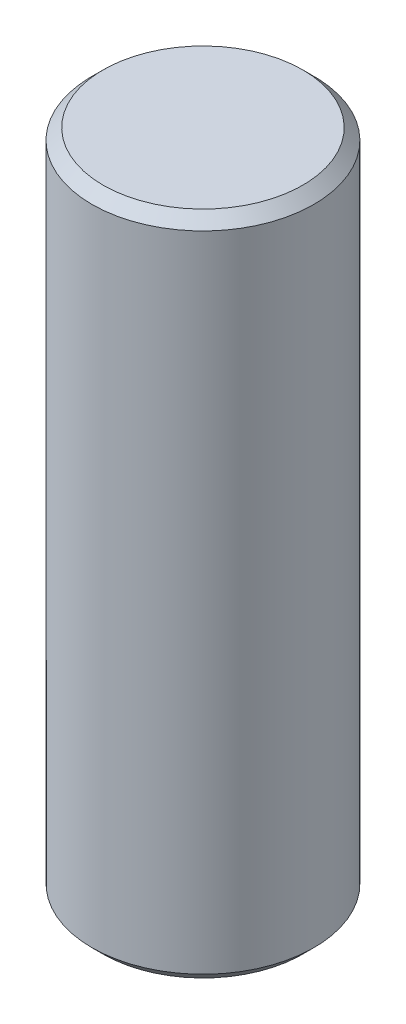
ISO-10303-21;
HEADER;
FILE_DESCRIPTION(('STEP AP214'),'2;1');
FILE_NAME('part.step','',(''),(''),'','','');
FILE_SCHEMA(('AUTOMOTIVE_DESIGN { 1 0 10303 214 1 1 1 1 }'));
ENDSEC;
DATA;
#1=APPLICATION_CONTEXT('core data for automotive mechanical design processes');
#2=APPLICATION_PROTOCOL_DEFINITION('international standard','automotive_design',2000,#1);
#3=PRODUCT_CONTEXT('',#1,'mechanical');
#4=PRODUCT('Part','Part','',(#3));
#5=PRODUCT_RELATED_PRODUCT_CATEGORY('part','',(#4));
#6=PRODUCT_DEFINITION_FORMATION('','',#4);
#7=PRODUCT_DEFINITION_CONTEXT('part definition',#1,'design');
#8=PRODUCT_DEFINITION('design','',#6,#7);
#9=PRODUCT_DEFINITION_SHAPE('','',#8);
#10=(LENGTH_UNIT() NAMED_UNIT(*) SI_UNIT(.MILLI.,.METRE.));
#11=(NAMED_UNIT(*) PLANE_ANGLE_UNIT() SI_UNIT($,.RADIAN.));
#12=(NAMED_UNIT(*) SI_UNIT($,.STERADIAN.) SOLID_ANGLE_UNIT());
#13=UNCERTAINTY_MEASURE_WITH_UNIT(LENGTH_MEASURE(1.E-05),#10,'distance_accuracy_value','');
#14=(GEOMETRIC_REPRESENTATION_CONTEXT(3) GLOBAL_UNCERTAINTY_ASSIGNED_CONTEXT((#13)) GLOBAL_UNIT_ASSIGNED_CONTEXT((#10,
#11,#12)) REPRESENTATION_CONTEXT('',''));
#15=CARTESIAN_POINT('',(0.,0.,0.));
#16=DIRECTION('',(0.,0.,1.));
#17=DIRECTION('',(1.,0.,0.));
#18=AXIS2_PLACEMENT_3D('',#15,#16,#17);
#19=CARTESIAN_POINT('',(0.,120.,0.));
#20=DIRECTION('',(0.,-1.,0.));
#21=DIRECTION('',(0.,0.,-1.));
#22=AXIS2_PLACEMENT_3D('',#19,#20,#21);
#23=CYLINDRICAL_SURFACE('',#22,20.);
#24=CARTESIAN_POINT('',(0.,2.00000000000002,0.));
#25=DIRECTION('',(0.,1.,0.));
#26=DIRECTION('',(0.,0.,1.));
#27=AXIS2_PLACEMENT_3D('',#24,#25,#26);
#28=CIRCLE('',#27,20.);
#29=CARTESIAN_POINT('',(0.,2.00000000000002,20.));
#30=VERTEX_POINT('',#29);
#31=EDGE_CURVE('E41',#30,#30,#28,.T.);
#32=ORIENTED_EDGE('',*,*,#31,.T.);
#33=EDGE_LOOP('',(#32));
#34=FACE_BOUND('',#33,.T.);
#35=CARTESIAN_POINT('',(0.,118.,0.));
#36=DIRECTION('',(0.,1.,0.));
#37=DIRECTION('',(0.,0.,1.));
#38=AXIS2_PLACEMENT_3D('',#35,#36,#37);
#39=CIRCLE('',#38,20.);
#40=CARTESIAN_POINT('',(0.,118.,20.));
#41=VERTEX_POINT('',#40);
#42=EDGE_CURVE('E45',#41,#41,#39,.F.);
#43=ORIENTED_EDGE('',*,*,#42,.T.);
#44=EDGE_LOOP('',(#43));
#45=FACE_BOUND('',#44,.T.);
#46=ADVANCED_FACE('F30',(#34,#45),#23,.T.);
#47=CARTESIAN_POINT('',(0.,120.,0.));
#48=DIRECTION('',(0.,1.,0.));
#49=DIRECTION('',(0.,0.,1.));
#50=AXIS2_PLACEMENT_3D('',#47,#48,#49);
#51=PLANE('',#50);
#52=CARTESIAN_POINT('',(0.,120.,0.));
#53=DIRECTION('',(0.,1.,0.));
#54=DIRECTION('',(0.,0.,1.));
#55=AXIS2_PLACEMENT_3D('',#52,#53,#54);
#56=CIRCLE('',#55,18.);
#57=CARTESIAN_POINT('',(0.,120.,18.));
#58=VERTEX_POINT('',#57);
#59=EDGE_CURVE('E10',#58,#58,#56,.T.);
#60=ORIENTED_EDGE('',*,*,#59,.T.);
#61=EDGE_LOOP('',(#60));
#62=FACE_BOUND('',#61,.T.);
#63=ADVANCED_FACE('F61',(#62),#51,.T.);
#64=CARTESIAN_POINT('',(0.,0.,0.));
#65=DIRECTION('',(0.,1.,0.));
#66=DIRECTION('',(0.,0.,1.));
#67=AXIS2_PLACEMENT_3D('',#64,#65,#66);
#68=PLANE('',#67);
#69=CARTESIAN_POINT('',(0.,0.,0.));
#70=DIRECTION('',(0.,1.,0.));
#71=DIRECTION('',(0.,0.,1.));
#72=AXIS2_PLACEMENT_3D('',#69,#70,#71);
#73=CIRCLE('',#72,18.);
#74=CARTESIAN_POINT('',(0.,0.,18.));
#75=VERTEX_POINT('',#74);
#76=EDGE_CURVE('E37',#75,#75,#73,.F.);
#77=ORIENTED_EDGE('',*,*,#76,.T.);
#78=EDGE_LOOP('',(#77));
#79=FACE_BOUND('',#78,.T.);
#80=ADVANCED_FACE('F58',(#79),#68,.F.);
#81=CARTESIAN_POINT('',(0.,2.00000000000002,0.));
#82=DIRECTION('',(0.,1.,0.));
#83=DIRECTION('',(0.,0.,1.));
#84=AXIS2_PLACEMENT_3D('',#81,#82,#83);
#85=CONICAL_SURFACE('',#84,20.,0.785398163397452);
#86=ORIENTED_EDGE('',*,*,#76,.F.);
#87=EDGE_LOOP('',(#86));
#88=FACE_BOUND('',#87,.T.);
#89=ORIENTED_EDGE('',*,*,#31,.F.);
#90=EDGE_LOOP('',(#89));
#91=FACE_BOUND('',#90,.T.);
#92=ADVANCED_FACE('F54',(#88,#91),#85,.T.);
#93=CARTESIAN_POINT('',(0.,120.,0.));
#94=DIRECTION('',(0.,-1.,0.));
#95=DIRECTION('',(0.,0.,-1.));
#96=AXIS2_PLACEMENT_3D('',#93,#94,#95);
#97=CONICAL_SURFACE('',#96,18.,0.785398163397448);
#98=ORIENTED_EDGE('',*,*,#42,.F.);
#99=EDGE_LOOP('',(#98));
#100=FACE_BOUND('',#99,.T.);
#101=ORIENTED_EDGE('',*,*,#59,.F.);
#102=EDGE_LOOP('',(#101));
#103=FACE_BOUND('',#102,.T.);
#104=ADVANCED_FACE('F32',(#100,#103),#97,.T.);
#105=CLOSED_SHELL('',(#46,#63,#80,#92,#104));
#106=MANIFOLD_SOLID_BREP('B2',#105);
#107=ADVANCED_BREP_SHAPE_REPRESENTATION('',(#18,#106),#14);
#108=SHAPE_DEFINITION_REPRESENTATION(#9,#107);
ENDSEC;
END-ISO-10303-21;
